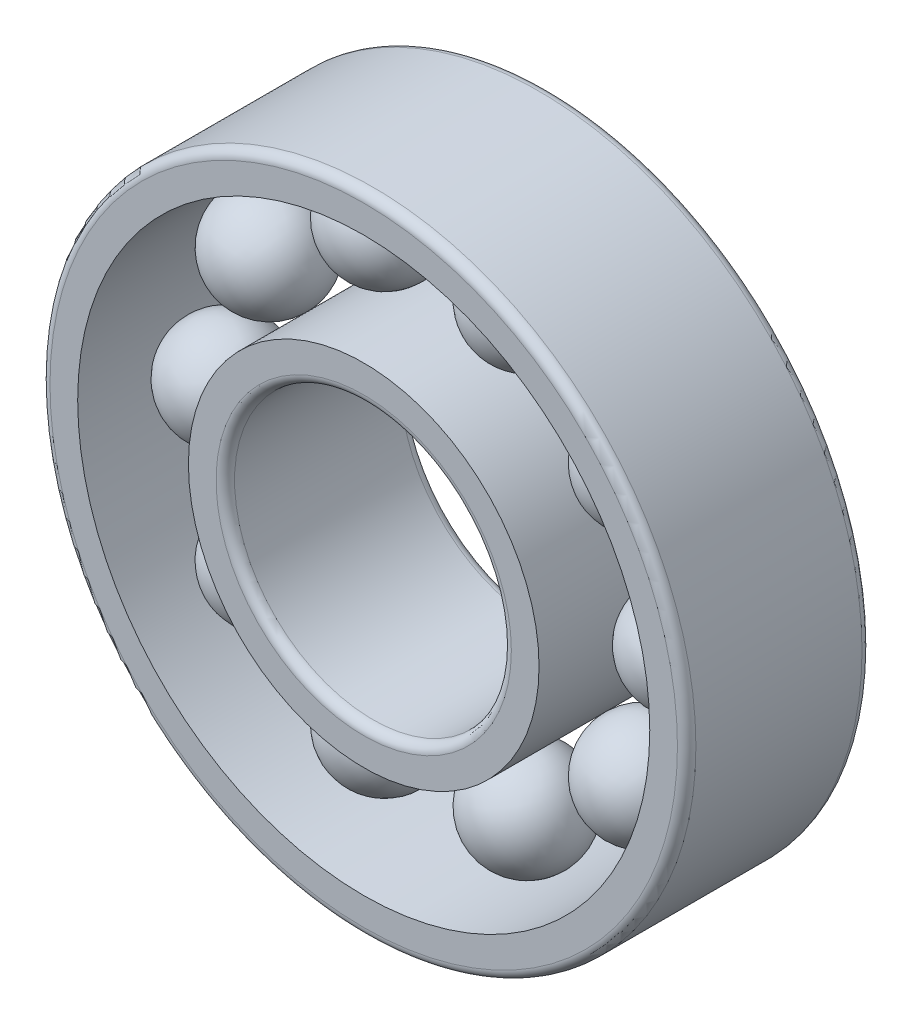
ISO-10303-21;
HEADER;
FILE_DESCRIPTION(('STEP AP214'),'2;1');
FILE_NAME('part.step','',(''),(''),'','','');
FILE_SCHEMA(('AUTOMOTIVE_DESIGN { 1 0 10303 214 1 1 1 1 }'));
ENDSEC;
DATA;
#1=APPLICATION_CONTEXT('core data for automotive mechanical design processes');
#2=APPLICATION_PROTOCOL_DEFINITION('international standard','automotive_design',2000,#1);
#3=PRODUCT_CONTEXT('',#1,'mechanical');
#4=PRODUCT('Part','Part','',(#3));
#5=PRODUCT_RELATED_PRODUCT_CATEGORY('part','',(#4));
#6=PRODUCT_DEFINITION_FORMATION('','',#4);
#7=PRODUCT_DEFINITION_CONTEXT('part definition',#1,'design');
#8=PRODUCT_DEFINITION('design','',#6,#7);
#9=PRODUCT_DEFINITION_SHAPE('','',#8);
#10=(LENGTH_UNIT() NAMED_UNIT(*) SI_UNIT(.MILLI.,.METRE.));
#11=(NAMED_UNIT(*) PLANE_ANGLE_UNIT() SI_UNIT($,.RADIAN.));
#12=(NAMED_UNIT(*) SI_UNIT($,.STERADIAN.) SOLID_ANGLE_UNIT());
#13=UNCERTAINTY_MEASURE_WITH_UNIT(LENGTH_MEASURE(1.E-05),#10,'distance_accuracy_value','');
#14=(GEOMETRIC_REPRESENTATION_CONTEXT(3) GLOBAL_UNCERTAINTY_ASSIGNED_CONTEXT((#13)) GLOBAL_UNIT_ASSIGNED_CONTEXT((#10,
#11,#12)) REPRESENTATION_CONTEXT('',''));
#15=CARTESIAN_POINT('',(0.,0.,0.));
#16=DIRECTION('',(0.,0.,1.));
#17=DIRECTION('',(1.,0.,0.));
#18=AXIS2_PLACEMENT_3D('',#15,#16,#17);
#19=CARTESIAN_POINT('',(2.02254248593737,-1.46946313073118,0.));
#20=DIRECTION('',(-0.809016994374947,0.587785252292473,0.));
#21=DIRECTION('',(0.,0.,-1.));
#22=AXIS2_PLACEMENT_3D('',#19,#20,#21);
#23=SPHERICAL_SURFACE('',#22,0.57);
#24=CARTESIAN_POINT('',(1.56140279914365,-1.13442553692447,0.));
#25=VERTEX_POINT('',#24);
#26=VERTEX_LOOP('',#25);
#27=FACE_BOUND('',#26,.T.);
#28=ADVANCED_FACE('F38',(#27),#23,.T.);
#29=CLOSED_SHELL('',(#28));
#30=MANIFOLD_SOLID_BREP('B2',#29);
#31=CARTESIAN_POINT('',(0.772542485937368,-2.37764129073788,0.));
#32=DIRECTION('',(-0.309016994374947,0.951056516295154,0.));
#33=DIRECTION('',(0.,0.,-1.));
#34=AXIS2_PLACEMENT_3D('',#31,#32,#33);
#35=SPHERICAL_SURFACE('',#34,0.57);
#36=CARTESIAN_POINT('',(0.596402799143648,-1.83553907644965,0.));
#37=VERTEX_POINT('',#36);
#38=VERTEX_LOOP('',#37);
#39=FACE_BOUND('',#38,.T.);
#40=ADVANCED_FACE('F57',(#39),#35,.T.);
#41=CLOSED_SHELL('',(#40));
#42=MANIFOLD_SOLID_BREP('B6',#41);
#43=CARTESIAN_POINT('',(-0.772542485937369,-2.37764129073788,0.));
#44=DIRECTION('',(0.309016994374948,0.951056516295154,0.));
#45=DIRECTION('',(0.,0.,-1.));
#46=AXIS2_PLACEMENT_3D('',#43,#44,#45);
#47=SPHERICAL_SURFACE('',#46,0.57);
#48=CARTESIAN_POINT('',(-0.596402799143649,-1.83553907644965,0.));
#49=VERTEX_POINT('',#48);
#50=VERTEX_LOOP('',#49);
#51=FACE_BOUND('',#50,.T.);
#52=ADVANCED_FACE('F76',(#51),#47,.T.);
#53=CLOSED_SHELL('',(#52));
#54=MANIFOLD_SOLID_BREP('B34',#53);
#55=CARTESIAN_POINT('',(-2.02254248593737,-1.46946313073118,0.));
#56=DIRECTION('',(0.809016994374948,0.587785252292473,0.));
#57=DIRECTION('',(0.,0.,-1.));
#58=AXIS2_PLACEMENT_3D('',#55,#56,#57);
#59=SPHERICAL_SURFACE('',#58,0.57);
#60=CARTESIAN_POINT('',(-1.56140279914365,-1.13442553692447,0.));
#61=VERTEX_POINT('',#60);
#62=VERTEX_LOOP('',#61);
#63=FACE_BOUND('',#62,.T.);
#64=ADVANCED_FACE('F95',(#63),#59,.T.);
#65=CLOSED_SHELL('',(#64));
#66=MANIFOLD_SOLID_BREP('B53',#65);
#67=CARTESIAN_POINT('',(-2.5,0.,0.));
#68=DIRECTION('',(1.,0.,0.));
#69=DIRECTION('',(0.,0.,-1.));
#70=AXIS2_PLACEMENT_3D('',#67,#68,#69);
#71=SPHERICAL_SURFACE('',#70,0.57);
#72=CARTESIAN_POINT('',(-1.93,0.,0.));
#73=VERTEX_POINT('',#72);
#74=VERTEX_LOOP('',#73);
#75=FACE_BOUND('',#74,.T.);
#76=ADVANCED_FACE('F114',(#75),#71,.T.);
#77=CLOSED_SHELL('',(#76));
#78=MANIFOLD_SOLID_BREP('B72',#77);
#79=CARTESIAN_POINT('',(-2.02254248593737,1.46946313073118,0.));
#80=DIRECTION('',(0.809016994374947,-0.587785252292473,0.));
#81=DIRECTION('',(0.,0.,-1.));
#82=AXIS2_PLACEMENT_3D('',#79,#80,#81);
#83=SPHERICAL_SURFACE('',#82,0.57);
#84=CARTESIAN_POINT('',(-1.56140279914365,1.13442553692447,0.));
#85=VERTEX_POINT('',#84);
#86=VERTEX_LOOP('',#85);
#87=FACE_BOUND('',#86,.T.);
#88=ADVANCED_FACE('F133',(#87),#83,.T.);
#89=CLOSED_SHELL('',(#88));
#90=MANIFOLD_SOLID_BREP('B91',#89);
#91=CARTESIAN_POINT('',(-0.772542485937368,2.37764129073788,0.));
#92=DIRECTION('',(0.309016994374947,-0.951056516295154,0.));
#93=DIRECTION('',(0.,0.,-1.));
#94=AXIS2_PLACEMENT_3D('',#91,#92,#93);
#95=SPHERICAL_SURFACE('',#94,0.57);
#96=CARTESIAN_POINT('',(-0.596402799143648,1.83553907644965,0.));
#97=VERTEX_POINT('',#96);
#98=VERTEX_LOOP('',#97);
#99=FACE_BOUND('',#98,.T.);
#100=ADVANCED_FACE('F152',(#99),#95,.T.);
#101=CLOSED_SHELL('',(#100));
#102=MANIFOLD_SOLID_BREP('B110',#101);
#103=CARTESIAN_POINT('',(0.772542485937369,2.37764129073788,0.));
#104=DIRECTION('',(-0.309016994374948,-0.951056516295154,0.));
#105=DIRECTION('',(0.,0.,-1.));
#106=AXIS2_PLACEMENT_3D('',#103,#104,#105);
#107=SPHERICAL_SURFACE('',#106,0.57);
#108=CARTESIAN_POINT('',(0.596402799143649,1.83553907644965,0.));
#109=VERTEX_POINT('',#108);
#110=VERTEX_LOOP('',#109);
#111=FACE_BOUND('',#110,.T.);
#112=ADVANCED_FACE('F171',(#111),#107,.T.);
#113=CLOSED_SHELL('',(#112));
#114=MANIFOLD_SOLID_BREP('B129',#113);
#115=CARTESIAN_POINT('',(2.02254248593737,1.46946313073118,0.));
#116=DIRECTION('',(-0.809016994374947,-0.587785252292473,0.));
#117=DIRECTION('',(0.,0.,-1.));
#118=AXIS2_PLACEMENT_3D('',#115,#116,#117);
#119=SPHERICAL_SURFACE('',#118,0.57);
#120=CARTESIAN_POINT('',(1.56140279914365,1.13442553692447,0.));
#121=VERTEX_POINT('',#120);
#122=VERTEX_LOOP('',#121);
#123=FACE_BOUND('',#122,.T.);
#124=ADVANCED_FACE('F190',(#123),#119,.T.);
#125=CLOSED_SHELL('',(#124));
#126=MANIFOLD_SOLID_BREP('B148',#125);
#127=CARTESIAN_POINT('',(2.5,0.,0.));
#128=DIRECTION('',(-1.,0.,0.));
#129=DIRECTION('',(0.,0.,-1.));
#130=AXIS2_PLACEMENT_3D('',#127,#128,#129);
#131=SPHERICAL_SURFACE('',#130,0.57);
#132=CARTESIAN_POINT('',(1.93,0.,0.));
#133=VERTEX_POINT('',#132);
#134=VERTEX_LOOP('',#133);
#135=FACE_BOUND('',#134,.T.);
#136=ADVANCED_FACE('F211',(#135),#131,.T.);
#137=CLOSED_SHELL('',(#136));
#138=MANIFOLD_SOLID_BREP('B167',#137);
#139=CARTESIAN_POINT('',(0.,0.,2.5));
#140=DIRECTION('',(0.,0.,1.));
#141=DIRECTION('',(1.,0.,0.));
#142=AXIS2_PLACEMENT_3D('',#139,#140,#141);
#143=CYLINDRICAL_SURFACE('',#142,3.1);
#144=CARTESIAN_POINT('',(0.,0.,1.));
#145=DIRECTION('',(0.,0.,1.));
#146=DIRECTION('',(1.,0.,0.));
#147=AXIS2_PLACEMENT_3D('',#144,#145,#146);
#148=CIRCLE('',#147,3.1);
#149=CARTESIAN_POINT('',(3.1,0.,1.));
#150=VERTEX_POINT('',#149);
#151=EDGE_CURVE('E251',#150,#150,#148,.T.);
#152=ORIENTED_EDGE('',*,*,#151,.T.);
#153=EDGE_LOOP('',(#152));
#154=FACE_BOUND('',#153,.T.);
#155=CARTESIAN_POINT('',(0.,0.,-1.));
#156=DIRECTION('',(0.,0.,1.));
#157=DIRECTION('',(1.,0.,0.));
#158=AXIS2_PLACEMENT_3D('',#155,#156,#157);
#159=CIRCLE('',#158,3.1);
#160=CARTESIAN_POINT('',(3.1,0.,-1.));
#161=VERTEX_POINT('',#160);
#162=EDGE_CURVE('E254',#161,#161,#159,.T.);
#163=ORIENTED_EDGE('',*,*,#162,.F.);
#164=EDGE_LOOP('',(#163));
#165=FACE_BOUND('',#164,.T.);
#166=ADVANCED_FACE('F231',(#154,#165),#143,.F.);
#167=CARTESIAN_POINT('',(3.1,0.,1.));
#168=DIRECTION('',(0.,0.,1.));
#169=DIRECTION('',(1.,0.,0.));
#170=AXIS2_PLACEMENT_3D('',#167,#168,#169);
#171=PLANE('',#170);
#172=CARTESIAN_POINT('',(0.,0.,1.));
#173=DIRECTION('',(0.,0.,1.));
#174=DIRECTION('',(1.,0.,0.));
#175=AXIS2_PLACEMENT_3D('',#172,#173,#174);
#176=CIRCLE('',#175,3.4);
#177=CARTESIAN_POINT('',(3.4,0.,1.));
#178=VERTEX_POINT('',#177);
#179=EDGE_CURVE('E210',#178,#178,#176,.T.);
#180=ORIENTED_EDGE('',*,*,#179,.T.);
#181=EDGE_LOOP('',(#180));
#182=FACE_BOUND('',#181,.T.);
#183=ORIENTED_EDGE('',*,*,#151,.F.);
#184=EDGE_LOOP('',(#183));
#185=FACE_BOUND('',#184,.T.);
#186=ADVANCED_FACE('F261',(#182,#185),#171,.T.);
#187=CARTESIAN_POINT('',(0.,0.,2.5));
#188=DIRECTION('',(0.,0.,1.));
#189=DIRECTION('',(1.,0.,0.));
#190=AXIS2_PLACEMENT_3D('',#187,#188,#189);
#191=CYLINDRICAL_SURFACE('',#190,3.5);
#192=CARTESIAN_POINT('',(0.,0.,-0.9));
#193=DIRECTION('',(0.,0.,-1.));
#194=DIRECTION('',(-1.,0.,0.));
#195=AXIS2_PLACEMENT_3D('',#192,#193,#194);
#196=CIRCLE('',#195,3.5);
#197=CARTESIAN_POINT('',(-3.5,0.,-0.9));
#198=VERTEX_POINT('',#197);
#199=EDGE_CURVE('E242',#198,#198,#196,.F.);
#200=ORIENTED_EDGE('',*,*,#199,.T.);
#201=EDGE_LOOP('',(#200));
#202=FACE_BOUND('',#201,.T.);
#203=CARTESIAN_POINT('',(0.,0.,0.9));
#204=DIRECTION('',(0.,0.,1.));
#205=DIRECTION('',(1.,0.,0.));
#206=AXIS2_PLACEMENT_3D('',#203,#204,#205);
#207=CIRCLE('',#206,3.5);
#208=CARTESIAN_POINT('',(3.5,0.,0.9));
#209=VERTEX_POINT('',#208);
#210=EDGE_CURVE('E246',#209,#209,#207,.F.);
#211=ORIENTED_EDGE('',*,*,#210,.T.);
#212=EDGE_LOOP('',(#211));
#213=FACE_BOUND('',#212,.T.);
#214=ADVANCED_FACE('F267',(#202,#213),#191,.T.);
#215=CARTESIAN_POINT('',(3.5,0.,-1.));
#216=DIRECTION('',(0.,0.,-1.));
#217=DIRECTION('',(-1.,0.,0.));
#218=AXIS2_PLACEMENT_3D('',#215,#216,#217);
#219=PLANE('',#218);
#220=CARTESIAN_POINT('',(0.,0.,-1.));
#221=DIRECTION('',(0.,0.,-1.));
#222=DIRECTION('',(-1.,0.,0.));
#223=AXIS2_PLACEMENT_3D('',#220,#221,#222);
#224=CIRCLE('',#223,3.4);
#225=CARTESIAN_POINT('',(-3.4,0.,-1.));
#226=VERTEX_POINT('',#225);
#227=EDGE_CURVE('E238',#226,#226,#224,.T.);
#228=ORIENTED_EDGE('',*,*,#227,.T.);
#229=EDGE_LOOP('',(#228));
#230=FACE_BOUND('',#229,.T.);
#231=ORIENTED_EDGE('',*,*,#162,.T.);
#232=EDGE_LOOP('',(#231));
#233=FACE_BOUND('',#232,.T.);
#234=ADVANCED_FACE('F258',(#230,#233),#219,.T.);
#235=CARTESIAN_POINT('',(0.,0.,-0.9));
#236=DIRECTION('',(0.,0.,-1.));
#237=DIRECTION('',(-1.,0.,0.));
#238=AXIS2_PLACEMENT_3D('',#235,#236,#237);
#239=TOROIDAL_SURFACE('',#238,3.4,0.1);
#240=ORIENTED_EDGE('',*,*,#227,.F.);
#241=EDGE_LOOP('',(#240));
#242=FACE_BOUND('',#241,.T.);
#243=ORIENTED_EDGE('',*,*,#199,.F.);
#244=EDGE_LOOP('',(#243));
#245=FACE_BOUND('',#244,.T.);
#246=ADVANCED_FACE('F270',(#242,#245),#239,.T.);
#247=CARTESIAN_POINT('',(0.,0.,0.9));
#248=DIRECTION('',(0.,0.,1.));
#249=DIRECTION('',(1.,0.,0.));
#250=AXIS2_PLACEMENT_3D('',#247,#248,#249);
#251=TOROIDAL_SURFACE('',#250,3.4,0.1);
#252=ORIENTED_EDGE('',*,*,#210,.F.);
#253=EDGE_LOOP('',(#252));
#254=FACE_BOUND('',#253,.T.);
#255=ORIENTED_EDGE('',*,*,#179,.F.);
#256=EDGE_LOOP('',(#255));
#257=FACE_BOUND('',#256,.T.);
#258=ADVANCED_FACE('F233',(#254,#257),#251,.T.);
#259=CLOSED_SHELL('',(#166,#186,#214,#234,#246,#258));
#260=MANIFOLD_SOLID_BREP('B186',#259);
#261=CARTESIAN_POINT('',(0.,0.,2.5));
#262=DIRECTION('',(0.,0.,1.));
#263=DIRECTION('',(1.,0.,0.));
#264=AXIS2_PLACEMENT_3D('',#261,#262,#263);
#265=CYLINDRICAL_SURFACE('',#264,1.5);
#266=CARTESIAN_POINT('',(0.,0.,-0.9));
#267=DIRECTION('',(0.,0.,-1.));
#268=DIRECTION('',(-1.,0.,0.));
#269=AXIS2_PLACEMENT_3D('',#266,#267,#268);
#270=CIRCLE('',#269,1.5);
#271=CARTESIAN_POINT('',(-1.5,0.,-0.9));
#272=VERTEX_POINT('',#271);
#273=EDGE_CURVE('E330',#272,#272,#270,.T.);
#274=ORIENTED_EDGE('',*,*,#273,.T.);
#275=EDGE_LOOP('',(#274));
#276=FACE_BOUND('',#275,.T.);
#277=CARTESIAN_POINT('',(0.,0.,0.9));
#278=DIRECTION('',(0.,0.,1.));
#279=DIRECTION('',(1.,0.,0.));
#280=AXIS2_PLACEMENT_3D('',#277,#278,#279);
#281=CIRCLE('',#280,1.5);
#282=CARTESIAN_POINT('',(1.5,0.,0.9));
#283=VERTEX_POINT('',#282);
#284=EDGE_CURVE('E334',#283,#283,#281,.T.);
#285=ORIENTED_EDGE('',*,*,#284,.T.);
#286=EDGE_LOOP('',(#285));
#287=FACE_BOUND('',#286,.T.);
#288=ADVANCED_FACE('F323',(#276,#287),#265,.F.);
#289=CARTESIAN_POINT('',(1.5,0.,1.));
#290=DIRECTION('',(0.,0.,1.));
#291=DIRECTION('',(1.,0.,0.));
#292=AXIS2_PLACEMENT_3D('',#289,#290,#291);
#293=PLANE('',#292);
#294=CARTESIAN_POINT('',(0.,0.,1.));
#295=DIRECTION('',(0.,0.,1.));
#296=DIRECTION('',(1.,0.,0.));
#297=AXIS2_PLACEMENT_3D('',#294,#295,#296);
#298=CIRCLE('',#297,1.6);
#299=CARTESIAN_POINT('',(1.6,0.,1.));
#300=VERTEX_POINT('',#299);
#301=EDGE_CURVE('E230',#300,#300,#298,.F.);
#302=ORIENTED_EDGE('',*,*,#301,.T.);
#303=EDGE_LOOP('',(#302));
#304=FACE_BOUND('',#303,.T.);
#305=CARTESIAN_POINT('',(0.,0.,1.));
#306=DIRECTION('',(0.,0.,1.));
#307=DIRECTION('',(1.,0.,0.));
#308=AXIS2_PLACEMENT_3D('',#305,#306,#307);
#309=CIRCLE('',#308,1.9);
#310=CARTESIAN_POINT('',(1.9,0.,1.));
#311=VERTEX_POINT('',#310);
#312=EDGE_CURVE('E343',#311,#311,#309,.T.);
#313=ORIENTED_EDGE('',*,*,#312,.T.);
#314=EDGE_LOOP('',(#313));
#315=FACE_BOUND('',#314,.T.);
#316=ADVANCED_FACE('F363',(#304,#315),#293,.T.);
#317=CARTESIAN_POINT('',(0.,0.,2.5));
#318=DIRECTION('',(0.,0.,1.));
#319=DIRECTION('',(1.,0.,0.));
#320=AXIS2_PLACEMENT_3D('',#317,#318,#319);
#321=CYLINDRICAL_SURFACE('',#320,1.9);
#322=CARTESIAN_POINT('',(0.,0.,-1.));
#323=DIRECTION('',(0.,0.,1.));
#324=DIRECTION('',(1.,0.,0.));
#325=AXIS2_PLACEMENT_3D('',#322,#323,#324);
#326=CIRCLE('',#325,1.9);
#327=CARTESIAN_POINT('',(1.9,0.,-1.));
#328=VERTEX_POINT('',#327);
#329=EDGE_CURVE('E346',#328,#328,#326,.T.);
#330=ORIENTED_EDGE('',*,*,#329,.T.);
#331=EDGE_LOOP('',(#330));
#332=FACE_BOUND('',#331,.T.);
#333=ORIENTED_EDGE('',*,*,#312,.F.);
#334=EDGE_LOOP('',(#333));
#335=FACE_BOUND('',#334,.T.);
#336=ADVANCED_FACE('F350',(#332,#335),#321,.T.);
#337=CARTESIAN_POINT('',(1.9,0.,-1.));
#338=DIRECTION('',(0.,0.,-1.));
#339=DIRECTION('',(-1.,0.,0.));
#340=AXIS2_PLACEMENT_3D('',#337,#338,#339);
#341=PLANE('',#340);
#342=CARTESIAN_POINT('',(0.,0.,-1.));
#343=DIRECTION('',(0.,0.,-1.));
#344=DIRECTION('',(-1.,0.,0.));
#345=AXIS2_PLACEMENT_3D('',#342,#343,#344);
#346=CIRCLE('',#345,1.6);
#347=CARTESIAN_POINT('',(-1.6,0.,-1.));
#348=VERTEX_POINT('',#347);
#349=EDGE_CURVE('E338',#348,#348,#346,.F.);
#350=ORIENTED_EDGE('',*,*,#349,.T.);
#351=EDGE_LOOP('',(#350));
#352=FACE_BOUND('',#351,.T.);
#353=ORIENTED_EDGE('',*,*,#329,.F.);
#354=EDGE_LOOP('',(#353));
#355=FACE_BOUND('',#354,.T.);
#356=ADVANCED_FACE('F353',(#352,#355),#341,.T.);
#357=CARTESIAN_POINT('',(0.,0.,-0.9));
#358=DIRECTION('',(0.,0.,-1.));
#359=DIRECTION('',(-1.,0.,0.));
#360=AXIS2_PLACEMENT_3D('',#357,#358,#359);
#361=TOROIDAL_SURFACE('',#360,1.6,0.1);
#362=ORIENTED_EDGE('',*,*,#273,.F.);
#363=EDGE_LOOP('',(#362));
#364=FACE_BOUND('',#363,.T.);
#365=ORIENTED_EDGE('',*,*,#349,.F.);
#366=EDGE_LOOP('',(#365));
#367=FACE_BOUND('',#366,.T.);
#368=ADVANCED_FACE('F355',(#364,#367),#361,.T.);
#369=CARTESIAN_POINT('',(0.,0.,0.9));
#370=DIRECTION('',(0.,0.,1.));
#371=DIRECTION('',(1.,0.,0.));
#372=AXIS2_PLACEMENT_3D('',#369,#370,#371);
#373=TOROIDAL_SURFACE('',#372,1.6,0.1);
#374=ORIENTED_EDGE('',*,*,#301,.F.);
#375=EDGE_LOOP('',(#374));
#376=FACE_BOUND('',#375,.T.);
#377=ORIENTED_EDGE('',*,*,#284,.F.);
#378=EDGE_LOOP('',(#377));
#379=FACE_BOUND('',#378,.T.);
#380=ADVANCED_FACE('F325',(#376,#379),#373,.T.);
#381=CLOSED_SHELL('',(#288,#316,#336,#356,#368,#380));
#382=MANIFOLD_SOLID_BREP('B205',#381);
#383=ADVANCED_BREP_SHAPE_REPRESENTATION('',(#18,#30,#42,#54,#66,#78,#90,#102,#114,#126,#138,
#260,#382),#14);
#384=SHAPE_DEFINITION_REPRESENTATION(#9,#383);
ENDSEC;
END-ISO-10303-21;
